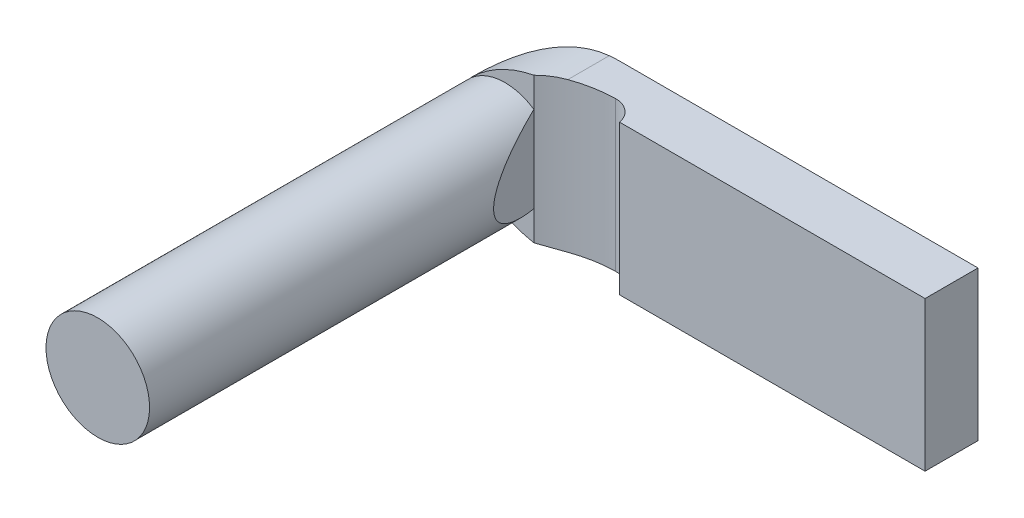
ISO-10303-21;
HEADER;
FILE_DESCRIPTION(('STEP AP214'),'2;1');
FILE_NAME('part.step','',(''),(''),'','','');
FILE_SCHEMA(('AUTOMOTIVE_DESIGN { 1 0 10303 214 1 1 1 1 }'));
ENDSEC;
DATA;
#1=APPLICATION_CONTEXT('core data for automotive mechanical design processes');
#2=APPLICATION_PROTOCOL_DEFINITION('international standard','automotive_design',2000,#1);
#3=PRODUCT_CONTEXT('',#1,'mechanical');
#4=PRODUCT('Part','Part','',(#3));
#5=PRODUCT_RELATED_PRODUCT_CATEGORY('part','',(#4));
#6=PRODUCT_DEFINITION_FORMATION('','',#4);
#7=PRODUCT_DEFINITION_CONTEXT('part definition',#1,'design');
#8=PRODUCT_DEFINITION('design','',#6,#7);
#9=PRODUCT_DEFINITION_SHAPE('','',#8);
#10=(LENGTH_UNIT() NAMED_UNIT(*) SI_UNIT(.MILLI.,.METRE.));
#11=(NAMED_UNIT(*) PLANE_ANGLE_UNIT() SI_UNIT($,.RADIAN.));
#12=(NAMED_UNIT(*) SI_UNIT($,.STERADIAN.) SOLID_ANGLE_UNIT());
#13=UNCERTAINTY_MEASURE_WITH_UNIT(LENGTH_MEASURE(1.E-05),#10,'distance_accuracy_value','');
#14=(GEOMETRIC_REPRESENTATION_CONTEXT(3) GLOBAL_UNCERTAINTY_ASSIGNED_CONTEXT((#13)) GLOBAL_UNIT_ASSIGNED_CONTEXT((#10,
#11,#12)) REPRESENTATION_CONTEXT('',''));
#15=CARTESIAN_POINT('',(0.,0.,0.));
#16=DIRECTION('',(0.,0.,1.));
#17=DIRECTION('',(1.,0.,0.));
#18=AXIS2_PLACEMENT_3D('',#15,#16,#17);
#19=CARTESIAN_POINT('',(2.55,0.,0.));
#20=DIRECTION('',(-1.,0.,0.));
#21=DIRECTION('',(0.,0.,1.));
#22=AXIS2_PLACEMENT_3D('',#19,#20,#21);
#23=PLANE('',#22);
#24=DIRECTION('',(0.,1.,0.));
#25=VECTOR('',#24,1.);
#26=CARTESIAN_POINT('',(2.55,0.,0.23));
#27=LINE('',#26,#25);
#28=CARTESIAN_POINT('',(2.55,-0.325,0.23));
#29=VERTEX_POINT('',#28);
#30=CARTESIAN_POINT('',(2.55,0.325,0.23));
#31=VERTEX_POINT('',#30);
#32=EDGE_CURVE('E36',#29,#31,#27,.T.);
#33=ORIENTED_EDGE('',*,*,#32,.F.);
#34=DIRECTION('',(0.,0.,-1.));
#35=VECTOR('',#34,1.);
#36=CARTESIAN_POINT('',(2.55,-0.325,0.115));
#37=LINE('',#36,#35);
#38=CARTESIAN_POINT('',(2.55,-0.325,0.));
#39=VERTEX_POINT('',#38);
#40=EDGE_CURVE('E11',#29,#39,#37,.T.);
#41=ORIENTED_EDGE('',*,*,#40,.T.);
#42=DIRECTION('',(0.,1.,0.));
#43=VECTOR('',#42,1.);
#44=CARTESIAN_POINT('',(2.55,0.,0.));
#45=LINE('',#44,#43);
#46=CARTESIAN_POINT('',(2.55,0.325,0.));
#47=VERTEX_POINT('',#46);
#48=EDGE_CURVE('E28',#39,#47,#45,.T.);
#49=ORIENTED_EDGE('',*,*,#48,.T.);
#50=DIRECTION('',(0.,0.,-1.));
#51=VECTOR('',#50,1.);
#52=CARTESIAN_POINT('',(2.55,0.325,0.115));
#53=LINE('',#52,#51);
#54=EDGE_CURVE('E279',#31,#47,#53,.T.);
#55=ORIENTED_EDGE('',*,*,#54,.F.);
#56=EDGE_LOOP('',(#33,#41,#49,#55));
#57=FACE_BOUND('',#56,.T.);
#58=ADVANCED_FACE('F18',(#57),#23,.F.);
#59=CARTESIAN_POINT('',(0.725,0.,2.));
#60=DIRECTION('',(0.,0.,-1.));
#61=DIRECTION('',(1.,0.,0.));
#62=AXIS2_PLACEMENT_3D('',#59,#60,#61);
#63=PLANE('',#62);
#64=CARTESIAN_POINT('',(0.725,0.,2.));
#65=DIRECTION('',(0.,0.,-1.));
#66=DIRECTION('',(1.,0.,0.));
#67=AXIS2_PLACEMENT_3D('',#64,#65,#66);
#68=CIRCLE('',#67,0.225);
#69=CARTESIAN_POINT('',(0.95,0.,2.));
#70=VERTEX_POINT('',#69);
#71=EDGE_CURVE('E124',#70,#70,#68,.T.);
#72=ORIENTED_EDGE('',*,*,#71,.F.);
#73=EDGE_LOOP('',(#72));
#74=FACE_BOUND('',#73,.T.);
#75=ADVANCED_FACE('F249',(#74),#63,.F.);
#76=CARTESIAN_POINT('',(0.95,0.,0.));
#77=DIRECTION('',(0.,0.,1.));
#78=DIRECTION('',(1.,0.,0.));
#79=AXIS2_PLACEMENT_3D('',#76,#77,#78);
#80=PLANE('',#79);
#81=DIRECTION('',(0.,-1.,0.));
#82=VECTOR('',#81,1.);
#83=CARTESIAN_POINT('',(1.,0.,0.));
#84=LINE('',#83,#82);
#85=CARTESIAN_POINT('',(1.,0.325,0.));
#86=VERTEX_POINT('',#85);
#87=CARTESIAN_POINT('',(1.,-0.325,0.));
#88=VERTEX_POINT('',#87);
#89=EDGE_CURVE('E265',#86,#88,#84,.T.);
#90=ORIENTED_EDGE('',*,*,#89,.F.);
#91=DIRECTION('',(-1.,0.,0.));
#92=VECTOR('',#91,1.);
#93=CARTESIAN_POINT('',(1.775,0.325,0.));
#94=LINE('',#93,#92);
#95=EDGE_CURVE('E267',#47,#86,#94,.T.);
#96=ORIENTED_EDGE('',*,*,#95,.F.);
#97=ORIENTED_EDGE('',*,*,#48,.F.);
#98=DIRECTION('',(-1.,0.,0.));
#99=VECTOR('',#98,1.);
#100=CARTESIAN_POINT('',(1.775,-0.325,0.));
#101=LINE('',#100,#99);
#102=EDGE_CURVE('E269',#39,#88,#101,.T.);
#103=ORIENTED_EDGE('',*,*,#102,.T.);
#104=EDGE_LOOP('',(#90,#96,#97,#103));
#105=FACE_BOUND('',#104,.T.);
#106=ADVANCED_FACE('F253',(#105),#80,.F.);
#107=CARTESIAN_POINT('',(1.,0.,0.5));
#108=DIRECTION('',(0.,1.,0.));
#109=DIRECTION('',(0.,0.,-1.));
#110=AXIS2_PLACEMENT_3D('',#107,#108,#109);
#111=CYLINDRICAL_SURFACE('',#110,0.5);
#112=ORIENTED_EDGE('',*,*,#89,.T.);
#113=CARTESIAN_POINT('',(1.,-0.325,0.5));
#114=DIRECTION('',(0.,1.,0.));
#115=DIRECTION('',(1.,0.,0.));
#116=AXIS2_PLACEMENT_3D('',#113,#114,#115);
#117=CIRCLE('',#116,0.5);
#118=CARTESIAN_POINT('',(0.95,-0.325,0.00250628144669002));
#119=VERTEX_POINT('',#118);
#120=EDGE_CURVE('E196',#88,#119,#117,.T.);
#121=ORIENTED_EDGE('',*,*,#120,.T.);
#122=CARTESIAN_POINT('',(0.579167491749967,-0.172905938131077,0.230000000000027));
#123=CARTESIAN_POINT('',(0.594481525065583,-0.188039794505541,0.206193075913775));
#124=CARTESIAN_POINT('',(0.611813178746644,-0.203249229350374,0.183578997305729));
#125=CARTESIAN_POINT('',(0.650742706479108,-0.232717496682813,0.141012563586862));
#126=CARTESIAN_POINT('',(0.672390528760634,-0.246962302652992,0.121096449289508));
#127=CARTESIAN_POINT('',(0.714567445336262,-0.270089914317339,0.088824390277777));
#128=CARTESIAN_POINT('',(0.73428674237854,-0.279462020808014,0.075770332042518));
#129=CARTESIAN_POINT('',(0.775945619935217,-0.29599327411751,0.052376650463509));
#130=CARTESIAN_POINT('',(0.797868075556542,-0.303167965097133,0.0420180423441926));
#131=CARTESIAN_POINT('',(0.8410050902512,-0.314049205941591,0.0254605018314506));
#132=CARTESIAN_POINT('',(0.862008945004077,-0.318060620307345,0.0189193070948811));
#133=CARTESIAN_POINT('',(0.905259136136628,-0.323566558397666,0.00853962233083629));
#134=CARTESIAN_POINT('',(0.927517538496798,-0.325029657332423,0.00473521208001916));
#135=CARTESIAN_POINT('',(0.95,-0.325,0.00250628144669));
#136=B_SPLINE_CURVE_WITH_KNOTS('',3,(#122,#123,#124,#125,#126,#127,#128,#129,#130,#131,#132,
#133,#134,#135),.UNSPECIFIED.,.F.,.F.,(4,2,2,2,2,2,4),(0.,0.0964010493014831,0.193990237511447,
0.270015277748108,0.345489399076702,0.412245993738809,0.479820124814963),.UNSPECIFIED.);
#137=CARTESIAN_POINT('',(0.579167491749983,-0.172905938131093,0.230000000000013));
#138=VERTEX_POINT('',#137);
#139=EDGE_CURVE('E220',#138,#119,#136,.T.);
#140=ORIENTED_EDGE('',*,*,#139,.F.);
#141=DIRECTION('',(0.,-1.,0.));
#142=VECTOR('',#141,1.);
#143=CARTESIAN_POINT('',(0.57916749175,0.,0.23));
#144=LINE('',#143,#142);
#145=CARTESIAN_POINT('',(0.579167491749971,-0.171341412208214,0.230000000000033));
#146=VERTEX_POINT('',#145);
#147=EDGE_CURVE('E129',#146,#138,#144,.T.);
#148=ORIENTED_EDGE('',*,*,#147,.F.);
#149=CARTESIAN_POINT('',(0.5,0.,0.5));
#150=CARTESIAN_POINT('',(0.499999999999995,-5.7746565647226E-07,0.499999999719079));
#151=CARTESIAN_POINT('',(0.50000000000294,-1.15490033675771E-06,0.499999936684402));
#152=CARTESIAN_POINT('',(0.500000000013319,-2.29213045936201E-06,0.499999715348737));
#153=CARTESIAN_POINT('',(0.500000000020776,-2.85182163147612E-06,0.499999556566385));
#154=CARTESIAN_POINT('',(0.500000000039255,-3.95919585697985E-06,0.499999163683635));
#155=CARTESIAN_POINT('',(0.50000000005036,-4.50623468956113E-06,0.499998927809302));
#156=CARTESIAN_POINT('',(0.500000000075246,-5.57081136091133E-06,0.499998399947566));
#157=CARTESIAN_POINT('',(0.500000000089024,-6.0883866244889E-06,0.499998108033506));
#158=CARTESIAN_POINT('',(0.500000000136034,-7.70017729146235E-06,0.499997113561711));
#159=CARTESIAN_POINT('',(0.500000000172913,-8.74810924054418E-06,0.499996335521057));
#160=CARTESIAN_POINT('',(0.500000000252641,-1.0722570934034E-05,0.499994661489089));
#161=CARTESIAN_POINT('',(0.500000000295434,-1.16501206008797E-05,0.499993766638062));
#162=CARTESIAN_POINT('',(0.500000000450473,-1.47809998148364E-05,0.49999054380303));
#163=CARTESIAN_POINT('',(0.50000000057136,-1.68299526184926E-05,0.499988063824963));
#164=CARTESIAN_POINT('',(0.500000000825262,-2.04891682177724E-05,0.499982955865055));
#165=CARTESIAN_POINT('',(0.500000000957627,-2.21133258570544E-05,0.499980337308505));
#166=CARTESIAN_POINT('',(0.500000001486064,-2.82969486640992E-05,0.499970081006428));
#167=CARTESIAN_POINT('',(0.500000001908255,-3.26097381353135E-05,0.499962299705483));
#168=CARTESIAN_POINT('',(0.500000003011803,-4.01888087849095E-05,0.499947221084814));
#169=CARTESIAN_POINT('',(0.500000003662283,-4.3516987373918E-05,0.499939955514118));
#170=CARTESIAN_POINT('',(0.500000009147845,-6.75531891366545E-05,0.499891664233341));
#171=CARTESIAN_POINT('',(0.500000019154832,-9.55202945833925E-05,0.499854710242689));
#172=CARTESIAN_POINT('',(0.500000071572373,-0.000195367716785842,0.499716794837562));
#173=CARTESIAN_POINT('',(0.500000140170535,-0.000261824816654125,0.499612916125663));
#174=CARTESIAN_POINT('',(0.500000511581878,-0.000511006351205102,0.499230256781094));
#175=CARTESIAN_POINT('',(0.500001014312389,-0.000699268173762711,0.498954443484109));
#176=CARTESIAN_POINT('',(0.500003856194312,-0.00142606385921486,0.497883206572794));
#177=CARTESIAN_POINT('',(0.500007871087961,-0.00195854133345431,0.497084556640982));
#178=CARTESIAN_POINT('',(0.500076771192126,-0.00815726539404534,0.487795076818709));
#179=CARTESIAN_POINT('',(0.500355441973697,-0.0138606232141957,0.479324064520508));
#180=CARTESIAN_POINT('',(0.501331477690675,-0.0250674376145888,0.462615124055144));
#181=CARTESIAN_POINT('',(0.502017105012857,-0.0305720749594833,0.454377199139787));
#182=CARTESIAN_POINT('',(0.503879468104124,-0.0420390434768299,0.437184141332002));
#183=CARTESIAN_POINT('',(0.505094716957693,-0.0479981716614765,0.428230911047886));
#184=CARTESIAN_POINT('',(0.508029105175276,-0.0598869898264683,0.41029025565808));
#185=CARTESIAN_POINT('',(0.509751945286597,-0.0658161262813432,0.401303075638004));
#186=CARTESIAN_POINT('',(0.514883636991639,-0.0810810419502258,0.378029195880052));
#187=CARTESIAN_POINT('',(0.51868534260577,-0.090340772860088,0.363776791364767));
#188=CARTESIAN_POINT('',(0.527540539772817,-0.108320981797468,0.335698665857435));
#189=CARTESIAN_POINT('',(0.532570656091618,-0.117048107823722,0.321869859257526));
#190=CARTESIAN_POINT('',(0.542550377348907,-0.131894059665949,0.29785061018629));
#191=CARTESIAN_POINT('',(0.547210651747034,-0.138123044146713,0.287608280410997));
#192=CARTESIAN_POINT('',(0.557326571805109,-0.150243859940892,0.267255313930031));
#193=CARTESIAN_POINT('',(0.562785428053575,-0.156134189896859,0.257145397304276));
#194=CARTESIAN_POINT('',(0.580837760024188,-0.173578854076331,0.226352870219456));
#195=CARTESIAN_POINT('',(0.594785929724175,-0.184404898280911,0.206003966195183));
#196=CARTESIAN_POINT('',(0.621854431080329,-0.200394370742645,0.172386499919227));
#197=CARTESIAN_POINT('',(0.634084338281593,-0.206292760317813,0.158748714413746));
#198=CARTESIAN_POINT('',(0.660296698872883,-0.215942677378491,0.132659767095127));
#199=CARTESIAN_POINT('',(0.674260735195237,-0.219714746487253,0.12019825499181));
#200=CARTESIAN_POINT('',(0.700478133339872,-0.223959872929676,0.0993747031610667));
#201=CARTESIAN_POINT('',(0.712408754564794,-0.22498449641405,0.0907213815422376));
#202=CARTESIAN_POINT('',(0.73702286650893,-0.225015144183454,0.0744885496194592));
#203=CARTESIAN_POINT('',(0.749707179184749,-0.224018923858933,0.0669102433692606));
#204=CARTESIAN_POINT('',(0.775502345527364,-0.219651601881529,0.0529908897163963));
#205=CARTESIAN_POINT('',(0.788615888039904,-0.216260611500969,0.0466607758104441));
#206=CARTESIAN_POINT('',(0.814529567613934,-0.20687822084177,0.0354577109840535));
#207=CARTESIAN_POINT('',(0.827330056476005,-0.200889895998203,0.0305830481924773));
#208=CARTESIAN_POINT('',(0.85010565122619,-0.187410469631852,0.0228676611263404));
#209=CARTESIAN_POINT('',(0.860221057719746,-0.180264084031154,0.0198343320112318));
#210=CARTESIAN_POINT('',(0.879265691651152,-0.164260838122762,0.0146953957088722));
#211=CARTESIAN_POINT('',(0.888195066049429,-0.155404190066863,0.0125896735074381));
#212=CARTESIAN_POINT('',(0.904079409072409,-0.136740622816675,0.0092230938156569));
#213=CARTESIAN_POINT('',(0.911112900633754,-0.127007064066505,0.00792399791257257));
#214=CARTESIAN_POINT('',(0.923558664861053,-0.106504791521638,0.00583743618475401));
#215=CARTESIAN_POINT('',(0.92897091216383,-0.0957360615359296,0.00504997836399645));
#216=CARTESIAN_POINT('',(0.938112091955226,-0.0732072425005823,0.00382284058893593));
#217=CARTESIAN_POINT('',(0.941800864215151,-0.0614304197024931,0.00339129391930888));
#218=CARTESIAN_POINT('',(0.947206494141587,-0.0374257349796377,0.00278747785699791));
#219=CARTESIAN_POINT('',(0.948923119734283,-0.0251978201469916,0.00261523897780932));
#220=CARTESIAN_POINT('',(0.950348930624402,-0.000388879574343036,0.00247075344644313));
#221=CARTESIAN_POINT('',(0.950019109389979,0.0121944276147387,0.00250239328482872));
#222=CARTESIAN_POINT('',(0.947269624855378,0.0371288753863014,0.00278639433458647));
#223=CARTESIAN_POINT('',(0.944849822592343,0.0494800004751957,0.0030387702227148));
#224=CARTESIAN_POINT('',(0.937982004667755,0.0736321856334904,0.00384914197937647));
#225=CARTESIAN_POINT('',(0.933528419636025,0.0854316365257677,0.00440797791671894));
#226=CARTESIAN_POINT('',(0.922729942132688,0.108099093597959,0.00597677278862145));
#227=CARTESIAN_POINT('',(0.916385197855847,0.118967172676019,0.00698669637820217));
#228=CARTESIAN_POINT('',(0.902105724281706,0.139324258838854,0.00962402814170151));
#229=CARTESIAN_POINT('',(0.894190994276466,0.148828253525003,0.0112438789247749));
#230=CARTESIAN_POINT('',(0.877017293987928,0.166330810463455,0.0152807216180426));
#231=CARTESIAN_POINT('',(0.867758750505332,0.174329848850762,0.0176974607420052));
#232=CARTESIAN_POINT('',(0.84852673422226,0.188426462502223,0.0233937029224233));
#233=CARTESIAN_POINT('',(0.838578817349748,0.194568942012197,0.0266485564598081));
#234=CARTESIAN_POINT('',(0.818149199673654,0.2051353575974,0.0341153997181115));
#235=CARTESIAN_POINT('',(0.807667566804579,0.209559511775742,0.0383272678597143));
#236=CARTESIAN_POINT('',(0.786473842230216,0.216730603910395,0.0477368422310753));
#237=CARTESIAN_POINT('',(0.775760598585738,0.219464393684984,0.0529418745510266));
#238=CARTESIAN_POINT('',(0.754514982605415,0.22331752956292,0.0642450245099114));
#239=CARTESIAN_POINT('',(0.743982786150128,0.224435384744095,0.0703439611930672));
#240=CARTESIAN_POINT('',(0.719611343201793,0.22537479351995,0.0856845508384899));
#241=CARTESIAN_POINT('',(0.705959886051496,0.224578281408322,0.0952632311985519));
#242=CARTESIAN_POINT('',(0.67989469499513,0.220826438718933,0.115543888077977));
#243=CARTESIAN_POINT('',(0.667480304880629,0.217872259688941,0.126245262806983));
#244=CARTESIAN_POINT('',(0.639667805980957,0.208876350137451,0.152650011685078));
#245=CARTESIAN_POINT('',(0.624874286057326,0.20209534970616,0.168734848432987));
#246=CARTESIAN_POINT('',(0.597757873270918,0.186239466367043,0.202218744452926));
#247=CARTESIAN_POINT('',(0.585474521489806,0.177132309856792,0.219633654588824));
#248=CARTESIAN_POINT('',(0.566481219060837,0.160040585333462,0.250411071204898));
#249=CARTESIAN_POINT('',(0.559160711928939,0.152412506091202,0.263604271008855));
#250=CARTESIAN_POINT('',(0.545847165240752,0.136517304932122,0.290313784774415));
#251=CARTESIAN_POINT('',(0.539856823018651,0.12824892956004,0.303830694803816));
#252=CARTESIAN_POINT('',(0.529488196523895,0.111755532426113,0.3302703312761));
#253=CARTESIAN_POINT('',(0.525035345630349,0.103557053487986,0.343180719778308));
#254=CARTESIAN_POINT('',(0.517262496194663,0.0869132959860724,0.369057948462132));
#255=CARTESIAN_POINT('',(0.513935415289248,0.0784699374909866,0.382023895553537));
#256=CARTESIAN_POINT('',(0.509543915178299,0.0650393397582102,0.40247698984575));
#257=CARTESIAN_POINT('',(0.508120563149782,0.0601196881791561,0.409933732734089));
#258=CARTESIAN_POINT('',(0.505594505948632,0.050132147477499,0.425014585876456));
#259=CARTESIAN_POINT('',(0.504498516434583,0.0450632295577383,0.432639149723475));
#260=CARTESIAN_POINT('',(0.502417456804449,0.0335401408340406,0.449937456085319));
#261=CARTESIAN_POINT('',(0.501539288877064,0.0270758654199153,0.459617230688682));
#262=CARTESIAN_POINT('',(0.500390330425554,0.0145557655041719,0.478286356082829));
#263=CARTESIAN_POINT('',(0.500080623086274,0.00850376100733665,0.487275617334357));
#264=CARTESIAN_POINT('',(0.500007883608312,0.00195967380727145,0.497082879224255));
#265=CARTESIAN_POINT('',(0.500003873126859,0.00142830634799508,0.49787984011282));
#266=CARTESIAN_POINT('',(0.500001021687495,0.000701839873785785,0.498950597762499));
#267=CARTESIAN_POINT('',(0.500000514979559,0.000512762286796911,0.499227600442628));
#268=CARTESIAN_POINT('',(0.500000140932095,0.000262556252120364,0.499611842206289));
#269=CARTESIAN_POINT('',(0.500000071902896,0.000195859263933365,0.499716098894184));
#270=CARTESIAN_POINT('',(0.500000019217309,9.56803685713167E-05,0.499854463723489));
#271=CARTESIAN_POINT('',(0.500000009170935,6.76484938693015E-05,0.499891502115669));
#272=CARTESIAN_POINT('',(0.500000003668987,4.35707559920982E-05,0.499939900840703));
#273=CARTESIAN_POINT('',(0.500000003017216,4.02399276543902E-05,0.4999471760554));
#274=CARTESIAN_POINT('',(0.500000001911515,3.26518440456769E-05,0.499962274440237));
#275=CARTESIAN_POINT('',(0.500000001488566,2.83322837427971E-05,0.499970065662499));
#276=CARTESIAN_POINT('',(0.500000000959202,2.21390336537735E-05,0.49998033317559));
#277=CARTESIAN_POINT('',(0.500000000826646,2.0512880538958E-05,0.499982953623646));
#278=CARTESIAN_POINT('',(0.500000000572357,1.68488603562364E-05,0.499988064910426));
#279=CARTESIAN_POINT('',(0.500000000451274,1.47970605402023E-05,0.499990546292259));
#280=CARTESIAN_POINT('',(0.500000000295982,1.16620070598943E-05,0.499993770350119));
#281=CARTESIAN_POINT('',(0.500000000253124,1.0733340887953E-05,0.499994665381864));
#282=CARTESIAN_POINT('',(0.500000000173267,8.75653208842286E-06,0.499996339542637));
#283=CARTESIAN_POINT('',(0.500000000136325,7.70736783759915E-06,0.499997117528257));
#284=CARTESIAN_POINT('',(0.500000000089232,6.09378934873127E-06,0.49999811165523));
#285=CARTESIAN_POINT('',(0.500000000075429,5.57567330498644E-06,0.499998403415165));
#286=CARTESIAN_POINT('',(0.500000000050495,4.51001676625306E-06,0.49999893087842));
#287=CARTESIAN_POINT('',(0.500000000039368,3.9624388036974E-06,0.499999166508188));
#288=CARTESIAN_POINT('',(0.500000000020849,2.8540342160401E-06,0.499999558792632));
#289=CARTESIAN_POINT('',(0.500000000013373,2.29385176436228E-06,0.499999717225388));
#290=CARTESIAN_POINT('',(0.500000000002963,1.15569978006618E-06,0.499999937728278));
#291=CARTESIAN_POINT('',(0.500000000000005,5.7783438215433E-07,0.5000000002811));
#292=CARTESIAN_POINT('',(0.5,0.,0.5));
#293=B_SPLINE_CURVE_WITH_KNOTS('',3,(#149,#150,#151,#152,#153,#154,#155,#156,#157,#158,#159,
#160,#161,#162,#163,#164,#165,#166,#167,#168,#169,#170,#171,#172,#173,#174,#175,#176,#177,#178,
#179,#180,#181,#182,#183,#184,#185,#186,#187,#188,#189,#190,#191,#192,#193,#194,#195,#196,#197,
#198,#199,#200,#201,#202,#203,#204,#205,#206,#207,#208,#209,#210,#211,#212,#213,#214,#215,#216,
#217,#218,#219,#220,#221,#222,#223,#224,#225,#226,#227,#228,#229,#230,#231,#232,#233,#234,#235,
#236,#237,#238,#239,#240,#241,#242,#243,#244,#245,#246,#247,#248,#249,#250,#251,#252,#253,#254,
#255,#256,#257,#258,#259,#260,#261,#262,#263,#264,#265,#266,#267,#268,#269,#270,#271,#272,#273,
#274,#275,#276,#277,#278,#279,#280,#281,#282,#283,#284,#285,#286,#287,#288,#289,#290,#291,#292),
.UNSPECIFIED.,.T.,.F.,(4,2,2,2,2,2,2,2,2,2,2,2,2,2,2,2,2,2,2,2,2,2,2,2,2,2,2,2,2,2,2,2,2,2,2,2,
2,2,2,2,2,2,2,2,2,2,2,2,2,2,2,2,2,2,2,2,2,2,2,2,2,2,2,2,2,2,2,2,2,2,2,4),(0.,
1.73081609835374E-06,3.47040716672475E-06,5.25323568498868E-06,7.03374665238368E-06,
1.09318336468315E-05,1.479437407244E-05,2.44017944221211E-05,3.36378795214498E-05,
6.03092519918189E-05,8.42563181139126E-05,0.00022229250040564,0.000592952753172089,
0.00159392482742708,0.00447441292107584,0.0351056803844816,0.0648936861097581,
0.0973518372798823,0.130052751359972,0.182245940080448,0.23351427084973,0.272069646372068,
0.310784520242123,0.391173575239965,0.448726169459282,0.505712797126296,0.54986855272862,
0.594073380257858,0.638649716128756,0.683173413817709,0.721228691202684,0.759279248776537,
0.79535121866181,0.831423752837083,0.868299408427032,0.905179402942621,0.94276448458506,
0.980352065452337,1.01804320026582,1.05573138230784,1.09296718008298,1.13019117738902,
1.1664253914743,1.20265500492933,1.23916299081471,1.27570463889255,1.32551453812584,
1.37529787320142,1.44357334310021,1.51285307643799,1.56350643073711,1.61426158143418,
1.6620048928502,1.70944200370326,1.73657454047807,1.76423051775385,1.79923699712073,
1.83174205744391,1.83461647806194,1.83562177017628,1.8359937781864,1.83613212927437,
1.83615610585096,1.83618281286499,1.83619205690209,1.83620167287116,1.83620553819121,
1.83620943911154,1.83621122080514,1.83621300482074,1.83621474553438,1.83621647745565),.UNSPECIFIED.);
#294=CARTESIAN_POINT('',(0.5,0.,0.5));
#295=VERTEX_POINT('',#294);
#296=EDGE_CURVE('E123',#295,#146,#293,.T.);
#297=ORIENTED_EDGE('',*,*,#296,.F.);
#298=CARTESIAN_POINT('',(0.5,0.,0.5));
#299=CARTESIAN_POINT('',(0.499999999999995,5.7746565647226E-07,0.499999999719079));
#300=CARTESIAN_POINT('',(0.50000000000294,1.15490033675771E-06,0.499999936684402));
#301=CARTESIAN_POINT('',(0.500000000013319,2.29213045936201E-06,0.499999715348737));
#302=CARTESIAN_POINT('',(0.500000000020776,2.85182163147612E-06,0.499999556566385));
#303=CARTESIAN_POINT('',(0.500000000039255,3.95919585697985E-06,0.499999163683635));
#304=CARTESIAN_POINT('',(0.50000000005036,4.50623468956113E-06,0.499998927809302));
#305=CARTESIAN_POINT('',(0.500000000075246,5.57081136091133E-06,0.499998399947566));
#306=CARTESIAN_POINT('',(0.500000000089024,6.0883866244889E-06,0.499998108033506));
#307=CARTESIAN_POINT('',(0.500000000136034,7.70017729146235E-06,0.499997113561711));
#308=CARTESIAN_POINT('',(0.500000000172913,8.74810924054418E-06,0.499996335521057));
#309=CARTESIAN_POINT('',(0.500000000252641,1.0722570934034E-05,0.499994661489089));
#310=CARTESIAN_POINT('',(0.500000000295434,1.16501206008797E-05,0.499993766638062));
#311=CARTESIAN_POINT('',(0.500000000450473,1.47809998148364E-05,0.49999054380303));
#312=CARTESIAN_POINT('',(0.50000000057136,1.68299526184926E-05,0.499988063824963));
#313=CARTESIAN_POINT('',(0.500000000825262,2.04891682177724E-05,0.499982955865055));
#314=CARTESIAN_POINT('',(0.500000000957627,2.21133258570544E-05,0.499980337308505));
#315=CARTESIAN_POINT('',(0.500000001486064,2.82969486640992E-05,0.499970081006428));
#316=CARTESIAN_POINT('',(0.500000001908255,3.26097381353135E-05,0.499962299705483));
#317=CARTESIAN_POINT('',(0.500000003011803,4.01888087849095E-05,0.499947221084814));
#318=CARTESIAN_POINT('',(0.500000003662283,4.3516987373918E-05,0.499939955514118));
#319=CARTESIAN_POINT('',(0.500000009147845,6.75531891366545E-05,0.499891664233341));
#320=CARTESIAN_POINT('',(0.500000019154832,9.55202945833925E-05,0.499854710242689));
#321=CARTESIAN_POINT('',(0.500000071572373,0.000195367716785842,0.499716794837562));
#322=CARTESIAN_POINT('',(0.500000140170535,0.000261824816654125,0.499612916125663));
#323=CARTESIAN_POINT('',(0.500000511581878,0.000511006351205102,0.499230256781094));
#324=CARTESIAN_POINT('',(0.500001014312389,0.000699268173762711,0.498954443484109));
#325=CARTESIAN_POINT('',(0.500003856194312,0.00142606385921486,0.497883206572794));
#326=CARTESIAN_POINT('',(0.500007871087961,0.00195854133345431,0.497084556640982));
#327=CARTESIAN_POINT('',(0.500076771192126,0.00815726539404534,0.487795076818709));
#328=CARTESIAN_POINT('',(0.500355441973697,0.0138606232141957,0.479324064520508));
#329=CARTESIAN_POINT('',(0.501331477690675,0.0250674376145888,0.462615124055144));
#330=CARTESIAN_POINT('',(0.502017105012857,0.0305720749594833,0.454377199139787));
#331=CARTESIAN_POINT('',(0.503879468104124,0.0420390434768299,0.437184141332002));
#332=CARTESIAN_POINT('',(0.505094716957693,0.0479981716614765,0.428230911047886));
#333=CARTESIAN_POINT('',(0.508029105175276,0.0598869898264683,0.41029025565808));
#334=CARTESIAN_POINT('',(0.509751945286597,0.0658161262813432,0.401303075638004));
#335=CARTESIAN_POINT('',(0.514883636991639,0.0810810419502258,0.378029195880052));
#336=CARTESIAN_POINT('',(0.51868534260577,0.090340772860088,0.363776791364767));
#337=CARTESIAN_POINT('',(0.527540539772817,0.108320981797468,0.335698665857435));
#338=CARTESIAN_POINT('',(0.532570656091618,0.117048107823722,0.321869859257526));
#339=CARTESIAN_POINT('',(0.542550377348907,0.131894059665949,0.29785061018629));
#340=CARTESIAN_POINT('',(0.547210651747034,0.138123044146713,0.287608280410997));
#341=CARTESIAN_POINT('',(0.557326571805109,0.150243859940892,0.267255313930031));
#342=CARTESIAN_POINT('',(0.562785428053575,0.156134189896859,0.257145397304276));
#343=CARTESIAN_POINT('',(0.580837760024188,0.173578854076331,0.226352870219456));
#344=CARTESIAN_POINT('',(0.594785929724175,0.184404898280911,0.206003966195183));
#345=CARTESIAN_POINT('',(0.621854431080329,0.200394370742645,0.172386499919227));
#346=CARTESIAN_POINT('',(0.634084338281593,0.206292760317813,0.158748714413746));
#347=CARTESIAN_POINT('',(0.660296698872883,0.215942677378491,0.132659767095127));
#348=CARTESIAN_POINT('',(0.674260735195237,0.219714746487253,0.12019825499181));
#349=CARTESIAN_POINT('',(0.700478133339872,0.223959872929676,0.0993747031610667));
#350=CARTESIAN_POINT('',(0.712408754564794,0.22498449641405,0.0907213815422376));
#351=CARTESIAN_POINT('',(0.73702286650893,0.225015144183454,0.0744885496194592));
#352=CARTESIAN_POINT('',(0.749707179184749,0.224018923858933,0.0669102433692606));
#353=CARTESIAN_POINT('',(0.775502345527364,0.219651601881529,0.0529908897163963));
#354=CARTESIAN_POINT('',(0.788615888039904,0.216260611500969,0.0466607758104441));
#355=CARTESIAN_POINT('',(0.814529567613934,0.20687822084177,0.0354577109840535));
#356=CARTESIAN_POINT('',(0.827330056476005,0.200889895998203,0.0305830481924773));
#357=CARTESIAN_POINT('',(0.85010565122619,0.187410469631852,0.0228676611263404));
#358=CARTESIAN_POINT('',(0.860221057719746,0.180264084031154,0.0198343320112318));
#359=CARTESIAN_POINT('',(0.879265691651152,0.164260838122762,0.0146953957088722));
#360=CARTESIAN_POINT('',(0.888195066049429,0.155404190066863,0.0125896735074381));
#361=CARTESIAN_POINT('',(0.904079409072409,0.136740622816675,0.0092230938156569));
#362=CARTESIAN_POINT('',(0.911112900633754,0.127007064066505,0.00792399791257257));
#363=CARTESIAN_POINT('',(0.923558664861053,0.106504791521638,0.00583743618475401));
#364=CARTESIAN_POINT('',(0.92897091216383,0.0957360615359296,0.00504997836399645));
#365=CARTESIAN_POINT('',(0.938112091955226,0.0732072425005823,0.00382284058893593));
#366=CARTESIAN_POINT('',(0.941800864215151,0.0614304197024931,0.00339129391930888));
#367=CARTESIAN_POINT('',(0.947206494141587,0.0374257349796377,0.00278747785699791));
#368=CARTESIAN_POINT('',(0.948923119734283,0.0251978201469916,0.00261523897780932));
#369=CARTESIAN_POINT('',(0.950348930624402,0.000388879574343036,0.00247075344644313));
#370=CARTESIAN_POINT('',(0.950019109389979,-0.0121944276147387,0.00250239328482872));
#371=CARTESIAN_POINT('',(0.947269624855378,-0.0371288753863014,0.00278639433458647));
#372=CARTESIAN_POINT('',(0.944849822592343,-0.0494800004751957,0.0030387702227148));
#373=CARTESIAN_POINT('',(0.937982004667755,-0.0736321856334904,0.00384914197937647));
#374=CARTESIAN_POINT('',(0.933528419636025,-0.0854316365257677,0.00440797791671894));
#375=CARTESIAN_POINT('',(0.922729942132688,-0.108099093597959,0.00597677278862145));
#376=CARTESIAN_POINT('',(0.916385197855847,-0.118967172676019,0.00698669637820217));
#377=CARTESIAN_POINT('',(0.902105724281706,-0.139324258838854,0.00962402814170151));
#378=CARTESIAN_POINT('',(0.894190994276466,-0.148828253525003,0.0112438789247749));
#379=CARTESIAN_POINT('',(0.877017293987928,-0.166330810463455,0.0152807216180426));
#380=CARTESIAN_POINT('',(0.867758750505332,-0.174329848850762,0.0176974607420052));
#381=CARTESIAN_POINT('',(0.84852673422226,-0.188426462502223,0.0233937029224233));
#382=CARTESIAN_POINT('',(0.838578817349748,-0.194568942012197,0.0266485564598081));
#383=CARTESIAN_POINT('',(0.818149199673654,-0.2051353575974,0.0341153997181115));
#384=CARTESIAN_POINT('',(0.807667566804579,-0.209559511775742,0.0383272678597143));
#385=CARTESIAN_POINT('',(0.786473842230216,-0.216730603910395,0.0477368422310753));
#386=CARTESIAN_POINT('',(0.775760598585738,-0.219464393684984,0.0529418745510266));
#387=CARTESIAN_POINT('',(0.754514982605415,-0.22331752956292,0.0642450245099114));
#388=CARTESIAN_POINT('',(0.743982786150128,-0.224435384744095,0.0703439611930672));
#389=CARTESIAN_POINT('',(0.719611343201793,-0.22537479351995,0.0856845508384899));
#390=CARTESIAN_POINT('',(0.705959886051496,-0.224578281408322,0.0952632311985519));
#391=CARTESIAN_POINT('',(0.67989469499513,-0.220826438718933,0.115543888077977));
#392=CARTESIAN_POINT('',(0.667480304880629,-0.217872259688941,0.126245262806983));
#393=CARTESIAN_POINT('',(0.639667805980957,-0.208876350137451,0.152650011685078));
#394=CARTESIAN_POINT('',(0.624874286057326,-0.20209534970616,0.168734848432987));
#395=CARTESIAN_POINT('',(0.597757873270918,-0.186239466367043,0.202218744452926));
#396=CARTESIAN_POINT('',(0.585474521489806,-0.177132309856792,0.219633654588824));
#397=CARTESIAN_POINT('',(0.566481219060837,-0.160040585333462,0.250411071204898));
#398=CARTESIAN_POINT('',(0.559160711928939,-0.152412506091202,0.263604271008855));
#399=CARTESIAN_POINT('',(0.545847165240752,-0.136517304932122,0.290313784774415));
#400=CARTESIAN_POINT('',(0.539856823018651,-0.12824892956004,0.303830694803816));
#401=CARTESIAN_POINT('',(0.529488196523895,-0.111755532426113,0.3302703312761));
#402=CARTESIAN_POINT('',(0.525035345630349,-0.103557053487986,0.343180719778308));
#403=CARTESIAN_POINT('',(0.517262496194663,-0.0869132959860724,0.369057948462132));
#404=CARTESIAN_POINT('',(0.513935415289248,-0.0784699374909866,0.382023895553537));
#405=CARTESIAN_POINT('',(0.509543915178299,-0.0650393397582102,0.40247698984575));
#406=CARTESIAN_POINT('',(0.508120563149782,-0.0601196881791561,0.409933732734089));
#407=CARTESIAN_POINT('',(0.505594505948632,-0.050132147477499,0.425014585876456));
#408=CARTESIAN_POINT('',(0.504498516434583,-0.0450632295577383,0.432639149723475));
#409=CARTESIAN_POINT('',(0.502417456804449,-0.0335401408340406,0.449937456085319));
#410=CARTESIAN_POINT('',(0.501539288877064,-0.0270758654199153,0.459617230688682));
#411=CARTESIAN_POINT('',(0.500390330425554,-0.0145557655041719,0.478286356082829));
#412=CARTESIAN_POINT('',(0.500080623086274,-0.00850376100733665,0.487275617334357));
#413=CARTESIAN_POINT('',(0.500007883608312,-0.00195967380727145,0.497082879224255));
#414=CARTESIAN_POINT('',(0.500003873126859,-0.00142830634799508,0.49787984011282));
#415=CARTESIAN_POINT('',(0.500001021687495,-0.000701839873785785,0.498950597762499));
#416=CARTESIAN_POINT('',(0.500000514979559,-0.000512762286796911,0.499227600442628));
#417=CARTESIAN_POINT('',(0.500000140932095,-0.000262556252120364,0.499611842206289));
#418=CARTESIAN_POINT('',(0.500000071902896,-0.000195859263933365,0.499716098894184));
#419=CARTESIAN_POINT('',(0.500000019217309,-9.56803685713167E-05,0.499854463723489));
#420=CARTESIAN_POINT('',(0.500000009170935,-6.76484938693015E-05,0.499891502115669));
#421=CARTESIAN_POINT('',(0.500000003668987,-4.35707559920982E-05,0.499939900840703));
#422=CARTESIAN_POINT('',(0.500000003017216,-4.02399276543902E-05,0.4999471760554));
#423=CARTESIAN_POINT('',(0.500000001911515,-3.26518440456769E-05,0.499962274440237));
#424=CARTESIAN_POINT('',(0.500000001488566,-2.83322837427971E-05,0.499970065662499));
#425=CARTESIAN_POINT('',(0.500000000959202,-2.21390336537735E-05,0.49998033317559));
#426=CARTESIAN_POINT('',(0.500000000826646,-2.0512880538958E-05,0.499982953623646));
#427=CARTESIAN_POINT('',(0.500000000572357,-1.68488603562364E-05,0.499988064910426));
#428=CARTESIAN_POINT('',(0.500000000451274,-1.47970605402023E-05,0.499990546292259));
#429=CARTESIAN_POINT('',(0.500000000295982,-1.16620070598943E-05,0.499993770350119));
#430=CARTESIAN_POINT('',(0.500000000253124,-1.0733340887953E-05,0.499994665381864));
#431=CARTESIAN_POINT('',(0.500000000173267,-8.75653208842286E-06,0.499996339542637));
#432=CARTESIAN_POINT('',(0.500000000136325,-7.70736783759915E-06,0.499997117528257));
#433=CARTESIAN_POINT('',(0.500000000089232,-6.09378934873127E-06,0.49999811165523));
#434=CARTESIAN_POINT('',(0.500000000075429,-5.57567330498644E-06,0.499998403415165));
#435=CARTESIAN_POINT('',(0.500000000050495,-4.51001676625306E-06,0.49999893087842));
#436=CARTESIAN_POINT('',(0.500000000039368,-3.9624388036974E-06,0.499999166508188));
#437=CARTESIAN_POINT('',(0.500000000020849,-2.8540342160401E-06,0.499999558792632));
#438=CARTESIAN_POINT('',(0.500000000013373,-2.29385176436228E-06,0.499999717225388));
#439=CARTESIAN_POINT('',(0.500000000002963,-1.15569978006618E-06,0.499999937728278));
#440=CARTESIAN_POINT('',(0.500000000000005,-5.7783438215433E-07,0.5000000002811));
#441=CARTESIAN_POINT('',(0.5,0.,0.5));
#442=B_SPLINE_CURVE_WITH_KNOTS('',3,(#298,#299,#300,#301,#302,#303,#304,#305,#306,#307,#308,
#309,#310,#311,#312,#313,#314,#315,#316,#317,#318,#319,#320,#321,#322,#323,#324,#325,#326,#327,
#328,#329,#330,#331,#332,#333,#334,#335,#336,#337,#338,#339,#340,#341,#342,#343,#344,#345,#346,
#347,#348,#349,#350,#351,#352,#353,#354,#355,#356,#357,#358,#359,#360,#361,#362,#363,#364,#365,
#366,#367,#368,#369,#370,#371,#372,#373,#374,#375,#376,#377,#378,#379,#380,#381,#382,#383,#384,
#385,#386,#387,#388,#389,#390,#391,#392,#393,#394,#395,#396,#397,#398,#399,#400,#401,#402,#403,
#404,#405,#406,#407,#408,#409,#410,#411,#412,#413,#414,#415,#416,#417,#418,#419,#420,#421,#422,
#423,#424,#425,#426,#427,#428,#429,#430,#431,#432,#433,#434,#435,#436,#437,#438,#439,#440,#441),
.UNSPECIFIED.,.T.,.F.,(4,2,2,2,2,2,2,2,2,2,2,2,2,2,2,2,2,2,2,2,2,2,2,2,2,2,2,2,2,2,2,2,2,2,2,2,
2,2,2,2,2,2,2,2,2,2,2,2,2,2,2,2,2,2,2,2,2,2,2,2,2,2,2,2,2,2,2,2,2,2,2,4),(0.,
1.73081609835374E-06,3.47040716672475E-06,5.25323568498868E-06,7.03374665238368E-06,
1.09318336468315E-05,1.479437407244E-05,2.44017944221211E-05,3.36378795214498E-05,
6.03092519918189E-05,8.42563181139126E-05,0.00022229250040564,0.000592952753172089,
0.00159392482742708,0.00447441292107584,0.0351056803844816,0.0648936861097581,
0.0973518372798823,0.130052751359972,0.182245940080448,0.23351427084973,0.272069646372068,
0.310784520242123,0.391173575239965,0.448726169459282,0.505712797126296,0.54986855272862,
0.594073380257858,0.638649716128756,0.683173413817709,0.721228691202684,0.759279248776537,
0.79535121866181,0.831423752837083,0.868299408427032,0.905179402942621,0.94276448458506,
0.980352065452337,1.01804320026582,1.05573138230784,1.09296718008298,1.13019117738902,
1.1664253914743,1.20265500492933,1.23916299081471,1.27570463889255,1.32551453812584,
1.37529787320142,1.44357334310021,1.51285307643799,1.56350643073711,1.61426158143418,
1.6620048928502,1.70944200370326,1.73657454047807,1.76423051775385,1.79923699712073,
1.83174205744391,1.83461647806194,1.83562177017628,1.8359937781864,1.83613212927437,
1.83615610585096,1.83618281286499,1.83619205690209,1.83620167287116,1.83620553819121,
1.83620943911154,1.83621122080514,1.83621300482074,1.83621474553438,1.83621647745565),.UNSPECIFIED.);
#443=CARTESIAN_POINT('',(0.527543923575,0.107870746186,0.336337982877));
#444=VERTEX_POINT('',#443);
#445=EDGE_CURVE('E188',#295,#444,#442,.T.);
#446=ORIENTED_EDGE('',*,*,#445,.T.);
#447=CARTESIAN_POINT('',(0.527543923575,0.107870746186,0.336337982877));
#448=CARTESIAN_POINT('',(0.540125816335,0.130901746399,0.3000168389));
#449=CARTESIAN_POINT('',(0.557180986132,0.152628205514,0.264269023359));
#450=CARTESIAN_POINT('',(0.57916749175,0.171341412208,0.23));
#451=B_SPLINE_CURVE_WITH_KNOTS('',3,(#447,#448,#449,#450),.UNSPECIFIED.,.F.,.F.,(4,4),(0.,
0.190113694744),.UNSPECIFIED.);
#452=CARTESIAN_POINT('',(0.57916749175,0.171341412208,0.23));
#453=VERTEX_POINT('',#452);
#454=EDGE_CURVE('E197',#444,#453,#451,.T.);
#455=ORIENTED_EDGE('',*,*,#454,.T.);
#456=DIRECTION('',(0.,-1.,0.));
#457=VECTOR('',#456,1.);
#458=CARTESIAN_POINT('',(0.57916749175,0.,0.23));
#459=LINE('',#458,#457);
#460=CARTESIAN_POINT('',(0.579167491749983,0.172905938131093,0.230000000000013));
#461=VERTEX_POINT('',#460);
#462=EDGE_CURVE('E141',#461,#453,#459,.T.);
#463=ORIENTED_EDGE('',*,*,#462,.F.);
#464=CARTESIAN_POINT('',(0.579167491749967,0.172905938131077,0.230000000000027));
#465=CARTESIAN_POINT('',(0.594481525065583,0.188039794505541,0.206193075913775));
#466=CARTESIAN_POINT('',(0.611813178746644,0.203249229350374,0.183578997305729));
#467=CARTESIAN_POINT('',(0.650742706479108,0.232717496682813,0.141012563586862));
#468=CARTESIAN_POINT('',(0.672390528760634,0.246962302652992,0.121096449289508));
#469=CARTESIAN_POINT('',(0.714567445336262,0.270089914317339,0.088824390277777));
#470=CARTESIAN_POINT('',(0.73428674237854,0.279462020808014,0.075770332042518));
#471=CARTESIAN_POINT('',(0.775945619935217,0.29599327411751,0.052376650463509));
#472=CARTESIAN_POINT('',(0.797868075556542,0.303167965097133,0.0420180423441926));
#473=CARTESIAN_POINT('',(0.8410050902512,0.314049205941591,0.0254605018314506));
#474=CARTESIAN_POINT('',(0.862008945004077,0.318060620307345,0.0189193070948811));
#475=CARTESIAN_POINT('',(0.905259136136628,0.323566558397666,0.00853962233083629));
#476=CARTESIAN_POINT('',(0.927517538496798,0.325029657332423,0.00473521208001916));
#477=CARTESIAN_POINT('',(0.95,0.325,0.00250628144669));
#478=B_SPLINE_CURVE_WITH_KNOTS('',3,(#464,#465,#466,#467,#468,#469,#470,#471,#472,#473,#474,
#475,#476,#477),.UNSPECIFIED.,.F.,.F.,(4,2,2,2,2,2,4),(0.,0.0964010493014831,0.193990237511447,
0.270015277748108,0.345489399076702,0.412245993738809,0.479820124814963),.UNSPECIFIED.);
#479=CARTESIAN_POINT('',(0.95,0.325,0.00250628144669002));
#480=VERTEX_POINT('',#479);
#481=EDGE_CURVE('E198',#461,#480,#478,.T.);
#482=ORIENTED_EDGE('',*,*,#481,.T.);
#483=CARTESIAN_POINT('',(1.,0.325,0.5));
#484=DIRECTION('',(0.,1.,0.));
#485=DIRECTION('',(1.,0.,0.));
#486=AXIS2_PLACEMENT_3D('',#483,#484,#485);
#487=CIRCLE('',#486,0.5);
#488=EDGE_CURVE('E274',#86,#480,#487,.T.);
#489=ORIENTED_EDGE('',*,*,#488,.F.);
#490=EDGE_LOOP('',(#112,#121,#140,#148,#297,#446,#455,#463,#482,#489));
#491=FACE_BOUND('',#490,.T.);
#492=ADVANCED_FACE('F205',(#491),#111,.T.);
#493=CARTESIAN_POINT('',(0.95,0.20312499994,0.72500000001));
#494=DIRECTION('',(0.,0.,1.));
#495=DIRECTION('',(-0.742268041335985,-0.670103092673986,0.));
#496=AXIS2_PLACEMENT_3D('',#493,#494,#495);
#497=CYLINDRICAL_SURFACE('',#496,0.52812499994);
#498=CARTESIAN_POINT('',(0.95,0.20312499994,0.23));
#499=DIRECTION('',(0.,0.,-1.));
#500=DIRECTION('',(1.,0.,0.));
#501=AXIS2_PLACEMENT_3D('',#498,#499,#500);
#502=CIRCLE('',#501,0.52812499994);
#503=CARTESIAN_POINT('',(0.850000000004,-0.3154461288,0.23));
#504=VERTEX_POINT('',#503);
#505=EDGE_CURVE('E111',#504,#138,#502,.T.);
#506=ORIENTED_EDGE('',*,*,#505,.T.);
#507=ORIENTED_EDGE('',*,*,#139,.T.);
#508=DIRECTION('',(0.,0.,1.));
#509=VECTOR('',#508,1.);
#510=CARTESIAN_POINT('',(0.95,-0.325,0.72500000001));
#511=LINE('',#510,#509);
#512=CARTESIAN_POINT('',(0.95,-0.325,0.182282482986));
#513=VERTEX_POINT('',#512);
#514=EDGE_CURVE('E185',#119,#513,#511,.T.);
#515=ORIENTED_EDGE('',*,*,#514,.T.);
#516=CARTESIAN_POINT('',(0.850000000004,-0.3154461288,0.23));
#517=CARTESIAN_POINT('',(0.881344776261,-0.321490579506,0.210949236064));
#518=CARTESIAN_POINT('',(0.91500723831,-0.325,0.194831133057));
#519=CARTESIAN_POINT('',(0.950000000002,-0.325,0.182282482985));
#520=B_SPLINE_CURVE_WITH_KNOTS('',3,(#516,#517,#518,#519),.UNSPECIFIED.,.F.,.F.,(4,4),(0.,
0.157719104142),.UNSPECIFIED.);
#521=EDGE_CURVE('E115',#504,#513,#520,.T.);
#522=ORIENTED_EDGE('',*,*,#521,.F.);
#523=EDGE_LOOP('',(#506,#507,#515,#522));
#524=FACE_BOUND('',#523,.T.);
#525=ADVANCED_FACE('F225',(#524),#497,.T.);
#526=CARTESIAN_POINT('',(0.,-0.325,0.));
#527=DIRECTION('',(0.,1.,0.));
#528=DIRECTION('',(-1.,0.,0.));
#529=AXIS2_PLACEMENT_3D('',#526,#527,#528);
#530=PLANE('',#529);
#531=CARTESIAN_POINT('',(1.125,-0.325,0.25));
#532=DIRECTION('',(0.,1.,0.));
#533=DIRECTION('',(1.,0.,0.));
#534=AXIS2_PLACEMENT_3D('',#531,#532,#533);
#535=CIRCLE('',#534,0.1);
#536=CARTESIAN_POINT('',(1.22297958971,-0.325,0.23));
#537=VERTEX_POINT('',#536);
#538=CARTESIAN_POINT('',(1.12500200006,-0.325,0.150103220546));
#539=VERTEX_POINT('',#538);
#540=EDGE_CURVE('E178',#537,#539,#535,.T.);
#541=ORIENTED_EDGE('',*,*,#540,.T.);
#542=CARTESIAN_POINT('',(1.13565713716,-0.325,0.7));
#543=DIRECTION('',(0.,1.,0.));
#544=DIRECTION('',(1.,0.,0.));
#545=AXIS2_PLACEMENT_3D('',#542,#543,#544);
#546=CIRCLE('',#545,0.55);
#547=EDGE_CURVE('E128',#539,#513,#546,.T.);
#548=ORIENTED_EDGE('',*,*,#547,.T.);
#549=ORIENTED_EDGE('',*,*,#514,.F.);
#550=ORIENTED_EDGE('',*,*,#120,.F.);
#551=ORIENTED_EDGE('',*,*,#102,.F.);
#552=ORIENTED_EDGE('',*,*,#40,.F.);
#553=DIRECTION('',(1.,0.,0.));
#554=VECTOR('',#553,1.);
#555=CARTESIAN_POINT('',(1.88648979486,-0.325,0.23));
#556=LINE('',#555,#554);
#557=EDGE_CURVE('E305',#537,#29,#556,.T.);
#558=ORIENTED_EDGE('',*,*,#557,.F.);
#559=EDGE_LOOP('',(#541,#548,#549,#550,#551,#552,#558));
#560=FACE_BOUND('',#559,.T.);
#561=ADVANCED_FACE('F229',(#560),#530,.F.);
#562=CARTESIAN_POINT('',(0.5,0.,0.23));
#563=DIRECTION('',(0.,0.,-1.));
#564=DIRECTION('',(1.,0.,0.));
#565=AXIS2_PLACEMENT_3D('',#562,#563,#564);
#566=PLANE('',#565);
#567=DIRECTION('',(0.,-1.,0.));
#568=VECTOR('',#567,1.);
#569=CARTESIAN_POINT('',(0.850000000004,-0.251264499068,0.23));
#570=LINE('',#569,#568);
#571=CARTESIAN_POINT('',(0.850000000002,-0.187082869333349,0.23));
#572=VERTEX_POINT('',#571);
#573=EDGE_CURVE('E105',#572,#504,#570,.T.);
#574=ORIENTED_EDGE('',*,*,#573,.F.);
#575=CARTESIAN_POINT('',(0.725,0.,0.23));
#576=DIRECTION('',(0.,0.,-1.));
#577=DIRECTION('',(1.,0.,0.));
#578=AXIS2_PLACEMENT_3D('',#575,#576,#577);
#579=CIRCLE('',#578,0.225);
#580=EDGE_CURVE('E109',#572,#146,#579,.T.);
#581=ORIENTED_EDGE('',*,*,#580,.T.);
#582=ORIENTED_EDGE('',*,*,#147,.T.);
#583=ORIENTED_EDGE('',*,*,#505,.F.);
#584=EDGE_LOOP('',(#574,#581,#582,#583));
#585=FACE_BOUND('',#584,.T.);
#586=ADVANCED_FACE('F107',(#585),#566,.F.);
#587=CARTESIAN_POINT('',(0.95,-0.20312499994,0.72500000001));
#588=DIRECTION('',(0.,0.,1.));
#589=DIRECTION('',(0.,1.,0.));
#590=AXIS2_PLACEMENT_3D('',#587,#588,#589);
#591=CYLINDRICAL_SURFACE('',#590,0.52812499994);
#592=DIRECTION('',(0.,0.,1.));
#593=VECTOR('',#592,1.);
#594=CARTESIAN_POINT('',(0.95,0.325,0.72500000001));
#595=LINE('',#594,#593);
#596=CARTESIAN_POINT('',(0.95,0.325,0.182282482986));
#597=VERTEX_POINT('',#596);
#598=EDGE_CURVE('E277',#480,#597,#595,.T.);
#599=ORIENTED_EDGE('',*,*,#598,.F.);
#600=ORIENTED_EDGE('',*,*,#481,.F.);
#601=CARTESIAN_POINT('',(0.95,-0.20312499994,0.23));
#602=DIRECTION('',(0.,0.,-1.));
#603=DIRECTION('',(1.,0.,0.));
#604=AXIS2_PLACEMENT_3D('',#601,#602,#603);
#605=CIRCLE('',#604,0.52812499994);
#606=CARTESIAN_POINT('',(0.85,0.315446128799,0.23));
#607=VERTEX_POINT('',#606);
#608=EDGE_CURVE('E283',#461,#607,#605,.T.);
#609=ORIENTED_EDGE('',*,*,#608,.T.);
#610=CARTESIAN_POINT('',(0.850000000004,0.3154461288,0.23));
#611=CARTESIAN_POINT('',(0.88134477626,0.321490579506,0.210949236064));
#612=CARTESIAN_POINT('',(0.915007238309,0.325,0.194831133057));
#613=CARTESIAN_POINT('',(0.950000000001,0.325,0.182282482986));
#614=B_SPLINE_CURVE_WITH_KNOTS('',3,(#610,#611,#612,#613),.UNSPECIFIED.,.F.,.F.,(4,4),(0.,
0.157719104139),.UNSPECIFIED.);
#615=EDGE_CURVE('E311',#607,#597,#614,.T.);
#616=ORIENTED_EDGE('',*,*,#615,.T.);
#617=EDGE_LOOP('',(#599,#600,#609,#616));
#618=FACE_BOUND('',#617,.T.);
#619=ADVANCED_FACE('F235',(#618),#591,.T.);
#620=CARTESIAN_POINT('',(0.,0.325,0.));
#621=DIRECTION('',(0.,1.,0.));
#622=DIRECTION('',(-1.,0.,0.));
#623=AXIS2_PLACEMENT_3D('',#620,#621,#622);
#624=PLANE('',#623);
#625=DIRECTION('',(1.,0.,0.));
#626=VECTOR('',#625,1.);
#627=CARTESIAN_POINT('',(1.88648979486,0.325,0.23));
#628=LINE('',#627,#626);
#629=CARTESIAN_POINT('',(1.22297958971,0.325,0.23));
#630=VERTEX_POINT('',#629);
#631=EDGE_CURVE('E316',#630,#31,#628,.T.);
#632=ORIENTED_EDGE('',*,*,#631,.T.);
#633=ORIENTED_EDGE('',*,*,#54,.T.);
#634=ORIENTED_EDGE('',*,*,#95,.T.);
#635=ORIENTED_EDGE('',*,*,#488,.T.);
#636=ORIENTED_EDGE('',*,*,#598,.T.);
#637=CARTESIAN_POINT('',(1.13565713716,0.325,0.7));
#638=DIRECTION('',(0.,1.,0.));
#639=DIRECTION('',(1.,0.,0.));
#640=AXIS2_PLACEMENT_3D('',#637,#638,#639);
#641=CIRCLE('',#640,0.55);
#642=CARTESIAN_POINT('',(1.12500200006,0.325,0.150103220546));
#643=VERTEX_POINT('',#642);
#644=EDGE_CURVE('E142',#643,#597,#641,.T.);
#645=ORIENTED_EDGE('',*,*,#644,.F.);
#646=CARTESIAN_POINT('',(1.125,0.325,0.25));
#647=DIRECTION('',(0.,1.,0.));
#648=DIRECTION('',(1.,0.,0.));
#649=AXIS2_PLACEMENT_3D('',#646,#647,#648);
#650=CIRCLE('',#649,0.1);
#651=EDGE_CURVE('E136',#630,#643,#650,.T.);
#652=ORIENTED_EDGE('',*,*,#651,.F.);
#653=EDGE_LOOP('',(#632,#633,#634,#635,#636,#645,#652));
#654=FACE_BOUND('',#653,.T.);
#655=ADVANCED_FACE('F238',(#654),#624,.T.);
#656=CARTESIAN_POINT('',(0.5,0.,0.23));
#657=DIRECTION('',(0.,0.,-1.));
#658=DIRECTION('',(1.,0.,0.));
#659=AXIS2_PLACEMENT_3D('',#656,#657,#658);
#660=PLANE('',#659);
#661=DIRECTION('',(0.,-1.,0.));
#662=VECTOR('',#661,1.);
#663=CARTESIAN_POINT('',(0.850000000004,0.251264499068,0.23));
#664=LINE('',#663,#662);
#665=CARTESIAN_POINT('',(0.850000000002,0.187082869337897,0.230000000003));
#666=VERTEX_POINT('',#665);
#667=EDGE_CURVE('E133',#607,#666,#664,.T.);
#668=ORIENTED_EDGE('',*,*,#667,.F.);
#669=ORIENTED_EDGE('',*,*,#608,.F.);
#670=ORIENTED_EDGE('',*,*,#462,.T.);
#671=CARTESIAN_POINT('',(0.725,0.,0.23));
#672=DIRECTION('',(0.,0.,-1.));
#673=DIRECTION('',(1.,0.,0.));
#674=AXIS2_PLACEMENT_3D('',#671,#672,#673);
#675=CIRCLE('',#674,0.225);
#676=EDGE_CURVE('E139',#453,#666,#675,.T.);
#677=ORIENTED_EDGE('',*,*,#676,.T.);
#678=EDGE_LOOP('',(#668,#669,#670,#677));
#679=FACE_BOUND('',#678,.T.);
#680=ADVANCED_FACE('F212',(#679),#660,.F.);
#681=CARTESIAN_POINT('',(0.725,0.,1.115));
#682=DIRECTION('',(0.,0.,-1.));
#683=DIRECTION('',(-0.877582561890372,0.479425538604204,0.));
#684=AXIS2_PLACEMENT_3D('',#681,#682,#683);
#685=CYLINDRICAL_SURFACE('',#684,0.225);
#686=ORIENTED_EDGE('',*,*,#71,.T.);
#687=EDGE_LOOP('',(#686));
#688=FACE_BOUND('',#687,.T.);
#689=CARTESIAN_POINT('',(0.725,0.,-0.113434677431529));
#690=DIRECTION('',(0.939692620785813,0.,-0.342020143325932));
#691=DIRECTION('',(-0.342020143325932,0.,-0.939692620785813));
#692=AXIS2_PLACEMENT_3D('',#689,#690,#691);
#693=ELLIPSE('',#692,0.657855990036189,0.225);
#694=EDGE_CURVE('E22',#572,#666,#693,.F.);
#695=ORIENTED_EDGE('',*,*,#694,.T.);
#696=ORIENTED_EDGE('',*,*,#676,.F.);
#697=ORIENTED_EDGE('',*,*,#454,.F.);
#698=ORIENTED_EDGE('',*,*,#445,.F.);
#699=ORIENTED_EDGE('',*,*,#296,.T.);
#700=ORIENTED_EDGE('',*,*,#580,.F.);
#701=EDGE_LOOP('',(#695,#696,#697,#698,#699,#700));
#702=FACE_BOUND('',#701,.T.);
#703=ADVANCED_FACE('F125',(#688,#702),#685,.T.);
#704=CARTESIAN_POINT('',(0.5,0.,0.23));
#705=DIRECTION('',(0.,0.,-1.));
#706=DIRECTION('',(1.,0.,0.));
#707=AXIS2_PLACEMENT_3D('',#704,#705,#706);
#708=PLANE('',#707);
#709=DIRECTION('',(0.,-1.,0.));
#710=VECTOR('',#709,1.);
#711=CARTESIAN_POINT('',(1.22297958971,0.,0.23));
#712=LINE('',#711,#710);
#713=EDGE_CURVE('E310',#630,#537,#712,.T.);
#714=ORIENTED_EDGE('',*,*,#713,.T.);
#715=ORIENTED_EDGE('',*,*,#557,.T.);
#716=ORIENTED_EDGE('',*,*,#32,.T.);
#717=ORIENTED_EDGE('',*,*,#631,.F.);
#718=EDGE_LOOP('',(#714,#715,#716,#717));
#719=FACE_BOUND('',#718,.T.);
#720=ADVANCED_FACE('F171',(#719),#708,.F.);
#721=CARTESIAN_POINT('',(1.125,0.,0.25));
#722=DIRECTION('',(0.,1.,0.));
#723=DIRECTION('',(1.,0.,0.));
#724=AXIS2_PLACEMENT_3D('',#721,#722,#723);
#725=CYLINDRICAL_SURFACE('',#724,0.1);
#726=CARTESIAN_POINT('',(1.125,0.325,0.15));
#727=DIRECTION('',(0.,-1.,0.));
#728=VECTOR('',#727,1.);
#729=LINE('',#726,#728);
#730=EDGE_CURVE('E149',#643,#539,#729,.T.);
#731=ORIENTED_EDGE('',*,*,#730,.T.);
#732=ORIENTED_EDGE('',*,*,#540,.F.);
#733=ORIENTED_EDGE('',*,*,#713,.F.);
#734=ORIENTED_EDGE('',*,*,#651,.T.);
#735=EDGE_LOOP('',(#731,#732,#733,#734));
#736=FACE_BOUND('',#735,.T.);
#737=ADVANCED_FACE('F162',(#736),#725,.F.);
#738=CARTESIAN_POINT('',(1.13565713716,0.,0.7));
#739=DIRECTION('',(0.,1.,0.));
#740=DIRECTION('',(-0.0193729765296093,0.,-0.999812326279479));
#741=AXIS2_PLACEMENT_3D('',#738,#739,#740);
#742=CYLINDRICAL_SURFACE('',#741,0.55);
#743=ORIENTED_EDGE('',*,*,#667,.T.);
#744=DIRECTION('',(0.,-1.,0.));
#745=VECTOR('',#744,1.);
#746=CARTESIAN_POINT('',(0.850000000004,0.,0.230000000006));
#747=LINE('',#746,#745);
#748=EDGE_CURVE('E114',#666,#572,#747,.T.);
#749=ORIENTED_EDGE('',*,*,#748,.T.);
#750=ORIENTED_EDGE('',*,*,#573,.T.);
#751=ORIENTED_EDGE('',*,*,#521,.T.);
#752=ORIENTED_EDGE('',*,*,#547,.F.);
#753=ORIENTED_EDGE('',*,*,#730,.F.);
#754=ORIENTED_EDGE('',*,*,#644,.T.);
#755=ORIENTED_EDGE('',*,*,#615,.F.);
#756=EDGE_LOOP('',(#743,#749,#750,#751,#752,#753,#754,#755));
#757=FACE_BOUND('',#756,.T.);
#758=ADVANCED_FACE('F131',(#757),#742,.F.);
#759=CARTESIAN_POINT('',(0.85,0.,0.23));
#760=DIRECTION('',(0.939692620785813,0.,-0.342020143325932));
#761=DIRECTION('',(0.342020143325932,0.,0.939692620785813));
#762=AXIS2_PLACEMENT_3D('',#759,#760,#761);
#763=PLANE('',#762);
#764=ORIENTED_EDGE('',*,*,#748,.F.);
#765=ORIENTED_EDGE('',*,*,#694,.F.);
#766=EDGE_LOOP('',(#764,#765));
#767=FACE_BOUND('',#766,.T.);
#768=ADVANCED_FACE('F20',(#767),#763,.T.);
#769=CLOSED_SHELL('',(#58,#75,#106,#492,#525,#561,#586,#619,#655,#680,#703,#720,#737,#758,#768));
#770=MANIFOLD_SOLID_BREP('B1',#769);
#771=ADVANCED_BREP_SHAPE_REPRESENTATION('',(#18,#770),#14);
#772=SHAPE_DEFINITION_REPRESENTATION(#9,#771);
ENDSEC;
END-ISO-10303-21;
